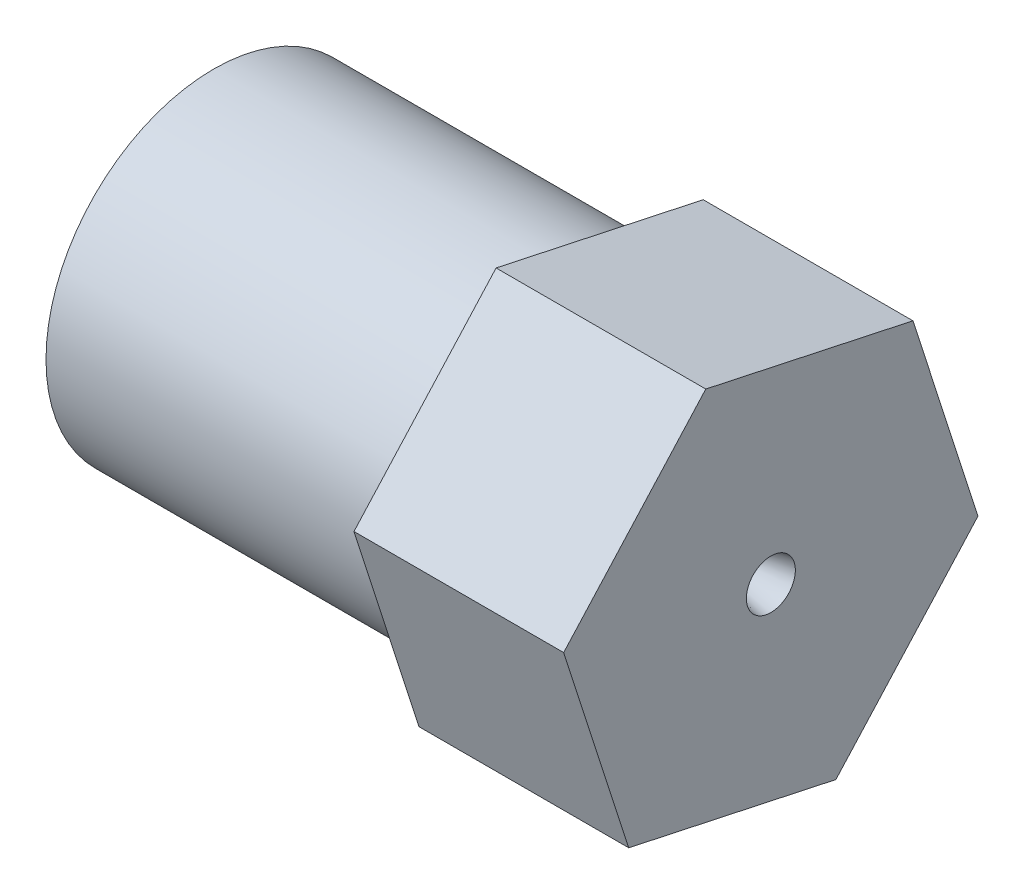
ISO-10303-21;
HEADER;
FILE_DESCRIPTION(('STEP AP214'),'2;1');
FILE_NAME('part.step','',(''),(''),'','','');
FILE_SCHEMA(('AUTOMOTIVE_DESIGN { 1 0 10303 214 1 1 1 1 }'));
ENDSEC;
DATA;
#1=APPLICATION_CONTEXT('core data for automotive mechanical design processes');
#2=APPLICATION_PROTOCOL_DEFINITION('international standard','automotive_design',2000,#1);
#3=PRODUCT_CONTEXT('',#1,'mechanical');
#4=PRODUCT('Part','Part','',(#3));
#5=PRODUCT_RELATED_PRODUCT_CATEGORY('part','',(#4));
#6=PRODUCT_DEFINITION_FORMATION('','',#4);
#7=PRODUCT_DEFINITION_CONTEXT('part definition',#1,'design');
#8=PRODUCT_DEFINITION('design','',#6,#7);
#9=PRODUCT_DEFINITION_SHAPE('','',#8);
#10=(LENGTH_UNIT() NAMED_UNIT(*) SI_UNIT(.MILLI.,.METRE.));
#11=(NAMED_UNIT(*) PLANE_ANGLE_UNIT() SI_UNIT($,.RADIAN.));
#12=(NAMED_UNIT(*) SI_UNIT($,.STERADIAN.) SOLID_ANGLE_UNIT());
#13=UNCERTAINTY_MEASURE_WITH_UNIT(LENGTH_MEASURE(1.E-05),#10,'distance_accuracy_value','');
#14=(GEOMETRIC_REPRESENTATION_CONTEXT(3) GLOBAL_UNCERTAINTY_ASSIGNED_CONTEXT((#13)) GLOBAL_UNIT_ASSIGNED_CONTEXT((#10,
#11,#12)) REPRESENTATION_CONTEXT('',''));
#15=CARTESIAN_POINT('',(0.,0.,0.));
#16=DIRECTION('',(0.,0.,1.));
#17=DIRECTION('',(1.,0.,0.));
#18=AXIS2_PLACEMENT_3D('',#15,#16,#17);
#19=CARTESIAN_POINT('',(0.,0.,0.));
#20=DIRECTION('',(-1.,0.,0.));
#21=DIRECTION('',(0.,0.,1.));
#22=AXIS2_PLACEMENT_3D('',#19,#20,#21);
#23=CYLINDRICAL_SURFACE('',#22,10.16);
#24=CARTESIAN_POINT('',(-11.3476244205248,0.,0.));
#25=DIRECTION('',(1.,0.,0.));
#26=DIRECTION('',(0.,0.,-1.));
#27=AXIS2_PLACEMENT_3D('',#24,#25,#26);
#28=CIRCLE('',#27,10.16);
#29=CARTESIAN_POINT('',(-11.3476244205248,0.,-10.16));
#30=VERTEX_POINT('',#29);
#31=EDGE_CURVE('E11',#30,#30,#28,.F.);
#32=ORIENTED_EDGE('',*,*,#31,.T.);
#33=EDGE_LOOP('',(#32));
#34=FACE_BOUND('',#33,.T.);
#35=CARTESIAN_POINT('',(-31.75,0.,0.));
#36=DIRECTION('',(-1.,0.,0.));
#37=DIRECTION('',(0.,0.,1.));
#38=AXIS2_PLACEMENT_3D('',#35,#36,#37);
#39=CIRCLE('',#38,10.16);
#40=CARTESIAN_POINT('',(-31.75,0.,10.16));
#41=VERTEX_POINT('',#40);
#42=EDGE_CURVE('E225',#41,#41,#39,.T.);
#43=ORIENTED_EDGE('',*,*,#42,.F.);
#44=EDGE_LOOP('',(#43));
#45=FACE_BOUND('',#44,.T.);
#46=ADVANCED_FACE('F37',(#34,#45),#23,.T.);
#47=CARTESIAN_POINT('',(0.,0.,0.));
#48=DIRECTION('',(-1.,0.,0.));
#49=DIRECTION('',(0.,0.,1.));
#50=AXIS2_PLACEMENT_3D('',#47,#48,#49);
#51=TOROIDAL_SURFACE('',#50,2.5,1.5);
#52=CARTESIAN_POINT('',(0.,0.,0.));
#53=DIRECTION('',(-1.,0.,0.));
#54=DIRECTION('',(0.,0.,1.));
#55=AXIS2_PLACEMENT_3D('',#52,#53,#54);
#56=CIRCLE('',#55,1.00000000000469);
#57=CARTESIAN_POINT('',(0.,0.,1.00000000000469));
#58=VERTEX_POINT('',#57);
#59=EDGE_CURVE('E177',#58,#58,#56,.T.);
#60=ORIENTED_EDGE('',*,*,#59,.F.);
#61=EDGE_LOOP('',(#60));
#62=FACE_BOUND('',#61,.T.);
#63=CARTESIAN_POINT('',(-1.06066017177981,0.,0.));
#64=DIRECTION('',(-1.,0.,0.));
#65=DIRECTION('',(0.,0.,1.));
#66=AXIS2_PLACEMENT_3D('',#63,#64,#65);
#67=CIRCLE('',#66,1.43933982822017);
#68=CARTESIAN_POINT('',(-1.06066017177981,0.,1.43933982822017));
#69=VERTEX_POINT('',#68);
#70=EDGE_CURVE('E142',#69,#69,#67,.T.);
#71=ORIENTED_EDGE('',*,*,#70,.T.);
#72=EDGE_LOOP('',(#71));
#73=FACE_BOUND('',#72,.T.);
#74=ADVANCED_FACE('F166',(#62,#73),#51,.T.);
#75=CARTESIAN_POINT('',(0.,0.,0.));
#76=DIRECTION('',(-1.,0.,0.));
#77=DIRECTION('',(0.,0.,1.));
#78=AXIS2_PLACEMENT_3D('',#75,#76,#77);
#79=TOROIDAL_SURFACE('',#78,1.4,0.399999999995305);
#80=CARTESIAN_POINT('',(0.136808057467297,0.,0.));
#81=DIRECTION('',(-1.,0.,0.));
#82=DIRECTION('',(0.,0.,1.));
#83=AXIS2_PLACEMENT_3D('',#80,#81,#82);
#84=CIRCLE('',#83,1.02412295166682);
#85=CARTESIAN_POINT('',(0.136808057467297,0.,1.02412295166682));
#86=VERTEX_POINT('',#85);
#87=EDGE_CURVE('E231',#86,#86,#84,.T.);
#88=ORIENTED_EDGE('',*,*,#87,.F.);
#89=EDGE_LOOP('',(#88));
#90=FACE_BOUND('',#89,.T.);
#91=ORIENTED_EDGE('',*,*,#59,.T.);
#92=EDGE_LOOP('',(#91));
#93=FACE_BOUND('',#92,.T.);
#94=ADVANCED_FACE('F162',(#90,#93),#79,.T.);
#95=CARTESIAN_POINT('',(338051.273850491,-941136.196809642,0.));
#96=CARTESIAN_POINT('',(-342020.006511755,939693.644910991,0.));
#97=CARTESIAN_POINT('',(345989.286405248,-938246.996520535,0.));
#98=B_SPLINE_CURVE_WITH_KNOTS('',2,(#95,#96,#97),.UNSPECIFIED.,.F.,.F.,(3,3),(0.,1.),.UNSPECIFIED.);
#99=CARTESIAN_POINT('',(0.,0.,0.));
#100=DIRECTION('',(-1.,0.,0.));
#101=AXIS1_PLACEMENT('',#99,#100);
#102=SURFACE_OF_REVOLUTION('',#98,#101);
#103=CARTESIAN_POINT('',(1.98737557947519,0.,0.));
#104=DIRECTION('',(-1.,0.,0.));
#105=DIRECTION('',(0.,0.,1.));
#106=AXIS2_PLACEMENT_3D('',#103,#104,#105);
#107=CIRCLE('',#106,1.48323969741913);
#108=CARTESIAN_POINT('',(1.98737557947519,0.,1.48323969741913));
#109=VERTEX_POINT('',#108);
#110=EDGE_CURVE('E228',#109,#109,#107,.T.);
#111=ORIENTED_EDGE('',*,*,#110,.F.);
#112=EDGE_LOOP('',(#111));
#113=FACE_BOUND('',#112,.T.);
#114=ORIENTED_EDGE('',*,*,#87,.T.);
#115=EDGE_LOOP('',(#114));
#116=FACE_BOUND('',#115,.T.);
#117=ADVANCED_FACE('F157',(#113,#116),#102,.T.);
#118=CARTESIAN_POINT('',(1.98737557947519,10.16,0.));
#119=DIRECTION('',(-1.,0.,0.));
#120=DIRECTION('',(0.,0.,1.));
#121=AXIS2_PLACEMENT_3D('',#118,#119,#120);
#122=PLANE('',#121);
#123=ORIENTED_EDGE('',*,*,#110,.T.);
#124=EDGE_LOOP('',(#123));
#125=FACE_BOUND('',#124,.T.);
#126=DIRECTION('',(0.,-0.951681663898051,-0.307086324345838));
#127=VECTOR('',#126,1.);
#128=CARTESIAN_POINT('',(1.98737557947519,-3.41249677929312,10.5755624900671));
#129=LINE('',#128,#127);
#130=CARTESIAN_POINT('',(1.98737557947519,2.69330707117882,12.5457684242007));
#131=VERTEX_POINT('',#130);
#132=CARTESIAN_POINT('',(1.98737557947519,-9.51830062976507,8.60535655593348));
#133=VERTEX_POINT('',#132);
#134=EDGE_CURVE('E125',#131,#133,#129,.T.);
#135=ORIENTED_EDGE('',*,*,#134,.T.);
#136=DIRECTION('',(0.,-0.209896273910742,-0.977723659424475));
#137=VECTOR('',#136,1.);
#138=CARTESIAN_POINT('',(1.98737557947519,-10.8649541653545,2.33247234383312));
#139=LINE('',#138,#137);
#140=CARTESIAN_POINT('',(1.98737557947519,-12.2116077009439,-3.94041186826723));
#141=VERTEX_POINT('',#140);
#142=EDGE_CURVE('E128',#133,#141,#139,.T.);
#143=ORIENTED_EDGE('',*,*,#142,.T.);
#144=DIRECTION('',(0.,0.741785389987309,-0.670637335078637));
#145=VECTOR('',#144,1.);
#146=CARTESIAN_POINT('',(1.98737557947519,-7.45245738606136,-8.24309014623397));
#147=LINE('',#146,#145);
#148=CARTESIAN_POINT('',(1.98737557947519,-2.69330707117882,-12.5457684242007));
#149=VERTEX_POINT('',#148);
#150=EDGE_CURVE('E131',#141,#149,#147,.T.);
#151=ORIENTED_EDGE('',*,*,#150,.T.);
#152=DIRECTION('',(0.,0.951681663898051,0.307086324345838));
#153=VECTOR('',#152,1.);
#154=CARTESIAN_POINT('',(1.98737557947519,3.41249677929312,-10.5755624900671));
#155=LINE('',#154,#153);
#156=CARTESIAN_POINT('',(1.98737557947519,9.51830062976506,-8.60535655593348));
#157=VERTEX_POINT('',#156);
#158=EDGE_CURVE('E134',#149,#157,#155,.T.);
#159=ORIENTED_EDGE('',*,*,#158,.T.);
#160=DIRECTION('',(0.,0.209896273910742,0.977723659424475));
#161=VECTOR('',#160,1.);
#162=CARTESIAN_POINT('',(1.98737557947519,10.8649541653545,-2.33247234383312));
#163=LINE('',#162,#161);
#164=CARTESIAN_POINT('',(1.98737557947519,12.2116077009439,3.94041186826724));
#165=VERTEX_POINT('',#164);
#166=EDGE_CURVE('E102',#157,#165,#163,.T.);
#167=ORIENTED_EDGE('',*,*,#166,.T.);
#168=DIRECTION('',(0.,-0.741785389987309,0.670637335078637));
#169=VECTOR('',#168,1.);
#170=CARTESIAN_POINT('',(1.98737557947519,7.45245738606136,8.24309014623397));
#171=LINE('',#170,#169);
#172=EDGE_CURVE('E137',#165,#131,#171,.T.);
#173=ORIENTED_EDGE('',*,*,#172,.T.);
#174=EDGE_LOOP('',(#135,#143,#151,#159,#167,#173));
#175=FACE_BOUND('',#174,.T.);
#176=ADVANCED_FACE('F161',(#125,#175),#122,.F.);
#177=CARTESIAN_POINT('',(-31.75,10.16,0.));
#178=DIRECTION('',(1.,0.,0.));
#179=DIRECTION('',(0.,0.,-1.));
#180=AXIS2_PLACEMENT_3D('',#177,#178,#179);
#181=PLANE('',#180);
#182=CARTESIAN_POINT('',(-31.75,0.,0.));
#183=DIRECTION('',(-1.,0.,0.));
#184=DIRECTION('',(0.,0.,1.));
#185=AXIS2_PLACEMENT_3D('',#182,#183,#184);
#186=CIRCLE('',#185,8.6614);
#187=CARTESIAN_POINT('',(-31.75,0.,8.6614));
#188=VERTEX_POINT('',#187);
#189=EDGE_CURVE('E222',#188,#188,#186,.T.);
#190=ORIENTED_EDGE('',*,*,#189,.F.);
#191=EDGE_LOOP('',(#190));
#192=FACE_BOUND('',#191,.T.);
#193=ORIENTED_EDGE('',*,*,#42,.T.);
#194=EDGE_LOOP('',(#193));
#195=FACE_BOUND('',#194,.T.);
#196=ADVANCED_FACE('F249',(#192,#195),#181,.F.);
#197=CARTESIAN_POINT('',(-31.115,0.,0.));
#198=DIRECTION('',(-1.,0.,0.));
#199=DIRECTION('',(0.,0.,1.));
#200=AXIS2_PLACEMENT_3D('',#197,#198,#199);
#201=TOROIDAL_SURFACE('',#200,8.6614,0.635);
#202=CARTESIAN_POINT('',(-31.115,0.,0.));
#203=DIRECTION('',(-1.,0.,0.));
#204=DIRECTION('',(0.,0.,1.));
#205=AXIS2_PLACEMENT_3D('',#202,#203,#204);
#206=CIRCLE('',#205,8.02639999999999);
#207=CARTESIAN_POINT('',(-31.115,0.,8.02639999999999));
#208=VERTEX_POINT('',#207);
#209=EDGE_CURVE('E219',#208,#208,#206,.T.);
#210=ORIENTED_EDGE('',*,*,#209,.F.);
#211=EDGE_LOOP('',(#210));
#212=FACE_BOUND('',#211,.T.);
#213=ORIENTED_EDGE('',*,*,#189,.T.);
#214=EDGE_LOOP('',(#213));
#215=FACE_BOUND('',#214,.T.);
#216=ADVANCED_FACE('F251',(#212,#215),#201,.T.);
#217=CARTESIAN_POINT('',(0.,0.,0.));
#218=DIRECTION('',(-1.,0.,0.));
#219=DIRECTION('',(0.,0.,1.));
#220=AXIS2_PLACEMENT_3D('',#217,#218,#219);
#221=CYLINDRICAL_SURFACE('',#220,8.02639999999999);
#222=CARTESIAN_POINT('',(-25.019,0.,0.));
#223=DIRECTION('',(-1.,0.,0.));
#224=DIRECTION('',(0.,0.,1.));
#225=AXIS2_PLACEMENT_3D('',#222,#223,#224);
#226=CIRCLE('',#225,8.02639999999999);
#227=CARTESIAN_POINT('',(-25.019,0.,8.02639999999999));
#228=VERTEX_POINT('',#227);
#229=EDGE_CURVE('E216',#228,#228,#226,.T.);
#230=ORIENTED_EDGE('',*,*,#229,.F.);
#231=EDGE_LOOP('',(#230));
#232=FACE_BOUND('',#231,.T.);
#233=ORIENTED_EDGE('',*,*,#209,.T.);
#234=EDGE_LOOP('',(#233));
#235=FACE_BOUND('',#234,.T.);
#236=ADVANCED_FACE('F258',(#232,#235),#221,.F.);
#237=CARTESIAN_POINT('',(-25.019,0.,0.));
#238=DIRECTION('',(-1.,0.,0.));
#239=DIRECTION('',(0.,0.,1.));
#240=AXIS2_PLACEMENT_3D('',#237,#238,#239);
#241=TOROIDAL_SURFACE('',#240,7.89939999999999,0.127);
#242=CARTESIAN_POINT('',(-24.892,0.,0.));
#243=DIRECTION('',(-1.,0.,0.));
#244=DIRECTION('',(0.,0.,1.));
#245=AXIS2_PLACEMENT_3D('',#242,#243,#244);
#246=CIRCLE('',#245,7.89939999999999);
#247=CARTESIAN_POINT('',(-24.892,0.,7.89939999999999));
#248=VERTEX_POINT('',#247);
#249=EDGE_CURVE('E213',#248,#248,#246,.T.);
#250=ORIENTED_EDGE('',*,*,#249,.F.);
#251=EDGE_LOOP('',(#250));
#252=FACE_BOUND('',#251,.T.);
#253=ORIENTED_EDGE('',*,*,#229,.T.);
#254=EDGE_LOOP('',(#253));
#255=FACE_BOUND('',#254,.T.);
#256=ADVANCED_FACE('F266',(#252,#255),#241,.F.);
#257=CARTESIAN_POINT('',(-24.892,6.9469,0.));
#258=DIRECTION('',(1.,0.,0.));
#259=DIRECTION('',(0.,0.,-1.));
#260=AXIS2_PLACEMENT_3D('',#257,#258,#259);
#261=PLANE('',#260);
#262=CARTESIAN_POINT('',(-24.892,0.,0.));
#263=DIRECTION('',(-1.,0.,0.));
#264=DIRECTION('',(0.,0.,1.));
#265=AXIS2_PLACEMENT_3D('',#262,#263,#264);
#266=CIRCLE('',#265,6.9469);
#267=CARTESIAN_POINT('',(-24.892,0.,6.9469));
#268=VERTEX_POINT('',#267);
#269=EDGE_CURVE('E210',#268,#268,#266,.T.);
#270=ORIENTED_EDGE('',*,*,#269,.F.);
#271=EDGE_LOOP('',(#270));
#272=FACE_BOUND('',#271,.T.);
#273=ORIENTED_EDGE('',*,*,#249,.T.);
#274=EDGE_LOOP('',(#273));
#275=FACE_BOUND('',#274,.T.);
#276=ADVANCED_FACE('F270',(#272,#275),#261,.F.);
#277=CARTESIAN_POINT('',(0.,0.,0.));
#278=DIRECTION('',(-1.,0.,0.));
#279=DIRECTION('',(0.,0.,1.));
#280=AXIS2_PLACEMENT_3D('',#277,#278,#279);
#281=CYLINDRICAL_SURFACE('',#280,6.9469);
#282=CARTESIAN_POINT('',(-20.066,0.,0.));
#283=DIRECTION('',(-1.,0.,0.));
#284=DIRECTION('',(0.,0.,1.));
#285=AXIS2_PLACEMENT_3D('',#282,#283,#284);
#286=CIRCLE('',#285,6.9469);
#287=CARTESIAN_POINT('',(-20.066,0.,6.9469));
#288=VERTEX_POINT('',#287);
#289=EDGE_CURVE('E207',#288,#288,#286,.T.);
#290=ORIENTED_EDGE('',*,*,#289,.F.);
#291=EDGE_LOOP('',(#290));
#292=FACE_BOUND('',#291,.T.);
#293=ORIENTED_EDGE('',*,*,#269,.T.);
#294=EDGE_LOOP('',(#293));
#295=FACE_BOUND('',#294,.T.);
#296=ADVANCED_FACE('F274',(#292,#295),#281,.F.);
#297=CARTESIAN_POINT('',(-20.066,0.,0.));
#298=DIRECTION('',(-1.,0.,0.));
#299=DIRECTION('',(0.,0.,1.));
#300=AXIS2_PLACEMENT_3D('',#297,#298,#299);
#301=TOROIDAL_SURFACE('',#300,6.8199,0.127);
#302=CARTESIAN_POINT('',(-19.939,0.,0.));
#303=DIRECTION('',(-1.,0.,0.));
#304=DIRECTION('',(0.,0.,1.));
#305=AXIS2_PLACEMENT_3D('',#302,#303,#304);
#306=CIRCLE('',#305,6.8199);
#307=CARTESIAN_POINT('',(-19.939,0.,6.8199));
#308=VERTEX_POINT('',#307);
#309=EDGE_CURVE('E204',#308,#308,#306,.T.);
#310=ORIENTED_EDGE('',*,*,#309,.F.);
#311=EDGE_LOOP('',(#310));
#312=FACE_BOUND('',#311,.T.);
#313=ORIENTED_EDGE('',*,*,#289,.T.);
#314=EDGE_LOOP('',(#313));
#315=FACE_BOUND('',#314,.T.);
#316=ADVANCED_FACE('F278',(#312,#315),#301,.F.);
#317=CARTESIAN_POINT('',(-19.939,5.46100000000001,0.));
#318=DIRECTION('',(1.,0.,0.));
#319=DIRECTION('',(0.,0.,-1.));
#320=AXIS2_PLACEMENT_3D('',#317,#318,#319);
#321=PLANE('',#320);
#322=CARTESIAN_POINT('',(-19.939,0.,0.));
#323=DIRECTION('',(-1.,0.,0.));
#324=DIRECTION('',(0.,0.,1.));
#325=AXIS2_PLACEMENT_3D('',#322,#323,#324);
#326=CIRCLE('',#325,5.46100000000001);
#327=CARTESIAN_POINT('',(-19.939,0.,5.46100000000001));
#328=VERTEX_POINT('',#327);
#329=EDGE_CURVE('E201',#328,#328,#326,.T.);
#330=ORIENTED_EDGE('',*,*,#329,.F.);
#331=EDGE_LOOP('',(#330));
#332=FACE_BOUND('',#331,.T.);
#333=ORIENTED_EDGE('',*,*,#309,.T.);
#334=EDGE_LOOP('',(#333));
#335=FACE_BOUND('',#334,.T.);
#336=ADVANCED_FACE('F282',(#332,#335),#321,.F.);
#337=CARTESIAN_POINT('',(-19.304,0.,0.));
#338=DIRECTION('',(-1.,0.,0.));
#339=DIRECTION('',(0.,0.,1.));
#340=AXIS2_PLACEMENT_3D('',#337,#338,#339);
#341=TOROIDAL_SURFACE('',#340,5.461,0.635);
#342=CARTESIAN_POINT('',(-19.304,0.,0.));
#343=DIRECTION('',(-1.,0.,0.));
#344=DIRECTION('',(0.,0.,1.));
#345=AXIS2_PLACEMENT_3D('',#342,#343,#344);
#346=CIRCLE('',#345,4.826);
#347=CARTESIAN_POINT('',(-19.304,0.,4.826));
#348=VERTEX_POINT('',#347);
#349=EDGE_CURVE('E198',#348,#348,#346,.T.);
#350=ORIENTED_EDGE('',*,*,#349,.F.);
#351=EDGE_LOOP('',(#350));
#352=FACE_BOUND('',#351,.T.);
#353=ORIENTED_EDGE('',*,*,#329,.T.);
#354=EDGE_LOOP('',(#353));
#355=FACE_BOUND('',#354,.T.);
#356=ADVANCED_FACE('F286',(#352,#355),#341,.T.);
#357=CARTESIAN_POINT('',(0.,0.,0.));
#358=DIRECTION('',(-1.,0.,0.));
#359=DIRECTION('',(0.,0.,1.));
#360=AXIS2_PLACEMENT_3D('',#357,#358,#359);
#361=CYLINDRICAL_SURFACE('',#360,4.826);
#362=CARTESIAN_POINT('',(-13.589,0.,0.));
#363=DIRECTION('',(-1.,0.,0.));
#364=DIRECTION('',(0.,0.,1.));
#365=AXIS2_PLACEMENT_3D('',#362,#363,#364);
#366=CIRCLE('',#365,4.826);
#367=CARTESIAN_POINT('',(-13.589,0.,4.826));
#368=VERTEX_POINT('',#367);
#369=EDGE_CURVE('E195',#368,#368,#366,.T.);
#370=ORIENTED_EDGE('',*,*,#369,.F.);
#371=EDGE_LOOP('',(#370));
#372=FACE_BOUND('',#371,.T.);
#373=ORIENTED_EDGE('',*,*,#349,.T.);
#374=EDGE_LOOP('',(#373));
#375=FACE_BOUND('',#374,.T.);
#376=ADVANCED_FACE('F290',(#372,#375),#361,.F.);
#377=CARTESIAN_POINT('',(-13.589,0.,0.));
#378=DIRECTION('',(-1.,0.,0.));
#379=DIRECTION('',(0.,0.,1.));
#380=AXIS2_PLACEMENT_3D('',#377,#378,#379);
#381=TOROIDAL_SURFACE('',#380,4.699,0.127);
#382=CARTESIAN_POINT('',(-13.462,0.,0.));
#383=DIRECTION('',(-1.,0.,0.));
#384=DIRECTION('',(0.,0.,1.));
#385=AXIS2_PLACEMENT_3D('',#382,#383,#384);
#386=CIRCLE('',#385,4.699);
#387=CARTESIAN_POINT('',(-13.462,0.,4.699));
#388=VERTEX_POINT('',#387);
#389=EDGE_CURVE('E192',#388,#388,#386,.T.);
#390=ORIENTED_EDGE('',*,*,#389,.F.);
#391=EDGE_LOOP('',(#390));
#392=FACE_BOUND('',#391,.T.);
#393=ORIENTED_EDGE('',*,*,#369,.T.);
#394=EDGE_LOOP('',(#393));
#395=FACE_BOUND('',#394,.T.);
#396=ADVANCED_FACE('F294',(#392,#395),#381,.F.);
#397=CARTESIAN_POINT('',(-13.462,4.445,0.));
#398=DIRECTION('',(1.,0.,0.));
#399=DIRECTION('',(0.,0.,-1.));
#400=AXIS2_PLACEMENT_3D('',#397,#398,#399);
#401=PLANE('',#400);
#402=CARTESIAN_POINT('',(-13.462,0.,0.));
#403=DIRECTION('',(-1.,0.,0.));
#404=DIRECTION('',(0.,0.,1.));
#405=AXIS2_PLACEMENT_3D('',#402,#403,#404);
#406=CIRCLE('',#405,4.445);
#407=CARTESIAN_POINT('',(-13.462,0.,4.445));
#408=VERTEX_POINT('',#407);
#409=EDGE_CURVE('E187',#408,#408,#406,.T.);
#410=ORIENTED_EDGE('',*,*,#409,.F.);
#411=EDGE_LOOP('',(#410));
#412=FACE_BOUND('',#411,.T.);
#413=ORIENTED_EDGE('',*,*,#389,.T.);
#414=EDGE_LOOP('',(#413));
#415=FACE_BOUND('',#414,.T.);
#416=ADVANCED_FACE('F298',(#412,#415),#401,.F.);
#417=CARTESIAN_POINT('',(0.,0.,0.));
#418=DIRECTION('',(-1.,0.,0.));
#419=DIRECTION('',(0.,0.,1.));
#420=AXIS2_PLACEMENT_3D('',#417,#418,#419);
#421=CYLINDRICAL_SURFACE('',#420,4.445);
#422=CARTESIAN_POINT('',(-5.38144840409426,0.,0.));
#423=DIRECTION('',(-1.,0.,0.));
#424=DIRECTION('',(0.,0.,1.));
#425=AXIS2_PLACEMENT_3D('',#422,#423,#424);
#426=CIRCLE('',#425,4.445);
#427=CARTESIAN_POINT('',(-5.38144840409426,0.,4.445));
#428=VERTEX_POINT('',#427);
#429=EDGE_CURVE('E183',#428,#428,#426,.T.);
#430=ORIENTED_EDGE('',*,*,#429,.F.);
#431=EDGE_LOOP('',(#430));
#432=FACE_BOUND('',#431,.T.);
#433=ORIENTED_EDGE('',*,*,#409,.T.);
#434=EDGE_LOOP('',(#433));
#435=FACE_BOUND('',#434,.T.);
#436=ADVANCED_FACE('F302',(#432,#435),#421,.F.);
#437=CARTESIAN_POINT('',(-5.38144840409426,0.,0.));
#438=DIRECTION('',(-1.,0.,0.));
#439=DIRECTION('',(0.,0.,1.));
#440=AXIS2_PLACEMENT_3D('',#437,#438,#439);
#441=DEGENERATE_TOROIDAL_SURFACE('',#440,1.27,3.175,.T.);
#442=CARTESIAN_POINT('',(-3.136384373827,0.,0.));
#443=DIRECTION('',(-1.,0.,0.));
#444=DIRECTION('',(0.,0.,1.));
#445=AXIS2_PLACEMENT_3D('',#442,#443,#444);
#446=CIRCLE('',#445,3.51506403026731);
#447=CARTESIAN_POINT('',(-3.136384373827,0.,3.51506403026731));
#448=VERTEX_POINT('',#447);
#449=EDGE_CURVE('E181',#448,#448,#446,.T.);
#450=ORIENTED_EDGE('',*,*,#449,.F.);
#451=EDGE_LOOP('',(#450));
#452=FACE_BOUND('',#451,.T.);
#453=ORIENTED_EDGE('',*,*,#429,.T.);
#454=EDGE_LOOP('',(#453));
#455=FACE_BOUND('',#454,.T.);
#456=ADVANCED_FACE('F306',(#452,#455),#441,.F.);
#457=CARTESIAN_POINT('',(-3.136384373827,0.,0.));
#458=DIRECTION('',(-1.,0.,0.));
#459=DIRECTION('',(0.,0.,1.));
#460=AXIS2_PLACEMENT_3D('',#457,#458,#459);
#461=CONICAL_SURFACE('',#460,3.51506403026731,0.785398163397437);
#462=ORIENTED_EDGE('',*,*,#70,.F.);
#463=EDGE_LOOP('',(#462));
#464=FACE_BOUND('',#463,.T.);
#465=ORIENTED_EDGE('',*,*,#449,.T.);
#466=EDGE_LOOP('',(#465));
#467=FACE_BOUND('',#466,.T.);
#468=ADVANCED_FACE('F310',(#464,#467),#461,.F.);
#469=CARTESIAN_POINT('',(-10.7126244205248,-3.41249677929312,10.5755624900671));
#470=DIRECTION('',(0.,-0.307086324345838,0.951681663898051));
#471=DIRECTION('',(0.,-0.951681663898051,-0.307086324345838));
#472=AXIS2_PLACEMENT_3D('',#469,#470,#471);
#473=PLANE('',#472);
#474=ORIENTED_EDGE('',*,*,#134,.F.);
#475=DIRECTION('',(1.,0.,0.));
#476=VECTOR('',#475,1.);
#477=CARTESIAN_POINT('',(-10.7126244205248,2.69330707117882,12.5457684242007));
#478=LINE('',#477,#476);
#479=CARTESIAN_POINT('',(-10.7126244205248,2.69330707117882,12.5457684242007));
#480=VERTEX_POINT('',#479);
#481=EDGE_CURVE('E54',#480,#131,#478,.T.);
#482=ORIENTED_EDGE('',*,*,#481,.F.);
#483=DIRECTION('',(0.,-0.951681663898051,-0.307086324345838));
#484=VECTOR('',#483,1.);
#485=CARTESIAN_POINT('',(-10.7126244205248,-3.41249677929312,10.5755624900671));
#486=LINE('',#485,#484);
#487=CARTESIAN_POINT('',(-10.7126244205248,-9.51830062976507,8.60535655593348));
#488=VERTEX_POINT('',#487);
#489=EDGE_CURVE('E140',#480,#488,#486,.T.);
#490=ORIENTED_EDGE('',*,*,#489,.T.);
#491=DIRECTION('',(1.,0.,0.));
#492=VECTOR('',#491,1.);
#493=CARTESIAN_POINT('',(-10.7126244205248,-9.51830062976507,8.60535655593348));
#494=LINE('',#493,#492);
#495=EDGE_CURVE('E89',#488,#133,#494,.T.);
#496=ORIENTED_EDGE('',*,*,#495,.T.);
#497=EDGE_LOOP('',(#474,#482,#490,#496));
#498=FACE_BOUND('',#497,.T.);
#499=ADVANCED_FACE('F314',(#498),#473,.T.);
#500=CARTESIAN_POINT('',(-10.7126244205248,7.45245738606136,8.24309014623397));
#501=DIRECTION('',(0.,0.670637335078637,0.741785389987309));
#502=DIRECTION('',(0.,-0.741785389987309,0.670637335078637));
#503=AXIS2_PLACEMENT_3D('',#500,#501,#502);
#504=PLANE('',#503);
#505=ORIENTED_EDGE('',*,*,#172,.F.);
#506=DIRECTION('',(1.,0.,0.));
#507=VECTOR('',#506,1.);
#508=CARTESIAN_POINT('',(-10.7126244205248,12.2116077009439,3.94041186826724));
#509=LINE('',#508,#507);
#510=CARTESIAN_POINT('',(-10.7126244205248,12.2116077009439,3.94041186826724));
#511=VERTEX_POINT('',#510);
#512=EDGE_CURVE('E77',#511,#165,#509,.T.);
#513=ORIENTED_EDGE('',*,*,#512,.F.);
#514=DIRECTION('',(0.,-0.741785389987309,0.670637335078637));
#515=VECTOR('',#514,1.);
#516=CARTESIAN_POINT('',(-10.7126244205248,7.45245738606136,8.24309014623397));
#517=LINE('',#516,#515);
#518=EDGE_CURVE('E115',#511,#480,#517,.T.);
#519=ORIENTED_EDGE('',*,*,#518,.T.);
#520=ORIENTED_EDGE('',*,*,#481,.T.);
#521=EDGE_LOOP('',(#505,#513,#519,#520));
#522=FACE_BOUND('',#521,.T.);
#523=ADVANCED_FACE('F317',(#522),#504,.T.);
#524=CARTESIAN_POINT('',(-10.7126244205248,10.8649541653545,-2.33247234383312));
#525=DIRECTION('',(0.,0.977723659424475,-0.209896273910742));
#526=DIRECTION('',(0.,0.209896273910742,0.977723659424475));
#527=AXIS2_PLACEMENT_3D('',#524,#525,#526);
#528=PLANE('',#527);
#529=ORIENTED_EDGE('',*,*,#166,.F.);
#530=DIRECTION('',(1.,0.,0.));
#531=VECTOR('',#530,1.);
#532=CARTESIAN_POINT('',(-10.7126244205248,9.51830062976506,-8.60535655593348));
#533=LINE('',#532,#531);
#534=CARTESIAN_POINT('',(-10.7126244205248,9.51830062976506,-8.60535655593348));
#535=VERTEX_POINT('',#534);
#536=EDGE_CURVE('E97',#535,#157,#533,.T.);
#537=ORIENTED_EDGE('',*,*,#536,.F.);
#538=DIRECTION('',(0.,0.209896273910742,0.977723659424475));
#539=VECTOR('',#538,1.);
#540=CARTESIAN_POINT('',(-10.7126244205248,10.8649541653545,-2.33247234383312));
#541=LINE('',#540,#539);
#542=EDGE_CURVE('E100',#535,#511,#541,.T.);
#543=ORIENTED_EDGE('',*,*,#542,.T.);
#544=ORIENTED_EDGE('',*,*,#512,.T.);
#545=EDGE_LOOP('',(#529,#537,#543,#544));
#546=FACE_BOUND('',#545,.T.);
#547=ADVANCED_FACE('F99',(#546),#528,.T.);
#548=CARTESIAN_POINT('',(-10.7126244205248,3.41249677929312,-10.5755624900671));
#549=DIRECTION('',(0.,0.307086324345838,-0.951681663898051));
#550=DIRECTION('',(0.,0.951681663898051,0.307086324345838));
#551=AXIS2_PLACEMENT_3D('',#548,#549,#550);
#552=PLANE('',#551);
#553=ORIENTED_EDGE('',*,*,#158,.F.);
#554=DIRECTION('',(1.,0.,0.));
#555=VECTOR('',#554,1.);
#556=CARTESIAN_POINT('',(-10.7126244205248,-2.69330707117882,-12.5457684242007));
#557=LINE('',#556,#555);
#558=CARTESIAN_POINT('',(-10.7126244205248,-2.69330707117882,-12.5457684242007));
#559=VERTEX_POINT('',#558);
#560=EDGE_CURVE('E107',#559,#149,#557,.T.);
#561=ORIENTED_EDGE('',*,*,#560,.F.);
#562=DIRECTION('',(0.,0.951681663898051,0.307086324345838));
#563=VECTOR('',#562,1.);
#564=CARTESIAN_POINT('',(-10.7126244205248,3.41249677929312,-10.5755624900671));
#565=LINE('',#564,#563);
#566=EDGE_CURVE('E113',#559,#535,#565,.T.);
#567=ORIENTED_EDGE('',*,*,#566,.T.);
#568=ORIENTED_EDGE('',*,*,#536,.T.);
#569=EDGE_LOOP('',(#553,#561,#567,#568));
#570=FACE_BOUND('',#569,.T.);
#571=ADVANCED_FACE('F117',(#570),#552,.T.);
#572=CARTESIAN_POINT('',(-10.7126244205248,-7.45245738606136,-8.24309014623397));
#573=DIRECTION('',(0.,-0.670637335078637,-0.741785389987309));
#574=DIRECTION('',(0.,0.741785389987309,-0.670637335078637));
#575=AXIS2_PLACEMENT_3D('',#572,#573,#574);
#576=PLANE('',#575);
#577=ORIENTED_EDGE('',*,*,#150,.F.);
#578=DIRECTION('',(1.,0.,0.));
#579=VECTOR('',#578,1.);
#580=CARTESIAN_POINT('',(-10.7126244205248,-12.2116077009439,-3.94041186826723));
#581=LINE('',#580,#579);
#582=CARTESIAN_POINT('',(-10.7126244205248,-12.2116077009439,-3.94041186826723));
#583=VERTEX_POINT('',#582);
#584=EDGE_CURVE('E145',#583,#141,#581,.T.);
#585=ORIENTED_EDGE('',*,*,#584,.F.);
#586=DIRECTION('',(0.,0.741785389987309,-0.670637335078637));
#587=VECTOR('',#586,1.);
#588=CARTESIAN_POINT('',(-10.7126244205248,-7.45245738606136,-8.24309014623397));
#589=LINE('',#588,#587);
#590=EDGE_CURVE('E118',#583,#559,#589,.T.);
#591=ORIENTED_EDGE('',*,*,#590,.T.);
#592=ORIENTED_EDGE('',*,*,#560,.T.);
#593=EDGE_LOOP('',(#577,#585,#591,#592));
#594=FACE_BOUND('',#593,.T.);
#595=ADVANCED_FACE('F320',(#594),#576,.T.);
#596=CARTESIAN_POINT('',(-10.7126244205248,-10.8649541653545,2.33247234383312));
#597=DIRECTION('',(0.,-0.977723659424475,0.209896273910742));
#598=DIRECTION('',(0.,-0.209896273910742,-0.977723659424475));
#599=AXIS2_PLACEMENT_3D('',#596,#597,#598);
#600=PLANE('',#599);
#601=ORIENTED_EDGE('',*,*,#142,.F.);
#602=ORIENTED_EDGE('',*,*,#495,.F.);
#603=DIRECTION('',(0.,-0.209896273910742,-0.977723659424475));
#604=VECTOR('',#603,1.);
#605=CARTESIAN_POINT('',(-10.7126244205248,-10.8649541653545,2.33247234383312));
#606=LINE('',#605,#604);
#607=EDGE_CURVE('E120',#488,#583,#606,.T.);
#608=ORIENTED_EDGE('',*,*,#607,.T.);
#609=ORIENTED_EDGE('',*,*,#584,.T.);
#610=EDGE_LOOP('',(#601,#602,#608,#609));
#611=FACE_BOUND('',#610,.T.);
#612=ADVANCED_FACE('F243',(#611),#600,.T.);
#613=CARTESIAN_POINT('',(-10.7126244205248,0.,0.));
#614=DIRECTION('',(1.,0.,0.));
#615=DIRECTION('',(0.,0.,-1.));
#616=AXIS2_PLACEMENT_3D('',#613,#614,#615);
#617=PLANE('',#616);
#618=CARTESIAN_POINT('',(-10.7126244205248,0.,0.));
#619=DIRECTION('',(1.,0.,0.));
#620=DIRECTION('',(0.,0.,-1.));
#621=AXIS2_PLACEMENT_3D('',#618,#619,#620);
#622=CIRCLE('',#621,10.795);
#623=CARTESIAN_POINT('',(-10.7126244205248,0.,-10.795));
#624=VERTEX_POINT('',#623);
#625=EDGE_CURVE('E46',#624,#624,#622,.T.);
#626=ORIENTED_EDGE('',*,*,#625,.T.);
#627=EDGE_LOOP('',(#626));
#628=FACE_BOUND('',#627,.T.);
#629=ORIENTED_EDGE('',*,*,#489,.F.);
#630=ORIENTED_EDGE('',*,*,#518,.F.);
#631=ORIENTED_EDGE('',*,*,#542,.F.);
#632=ORIENTED_EDGE('',*,*,#566,.F.);
#633=ORIENTED_EDGE('',*,*,#590,.F.);
#634=ORIENTED_EDGE('',*,*,#607,.F.);
#635=EDGE_LOOP('',(#629,#630,#631,#632,#633,#634));
#636=FACE_BOUND('',#635,.T.);
#637=ADVANCED_FACE('F111',(#628,#636),#617,.F.);
#638=CARTESIAN_POINT('',(-11.3476244205248,0.,0.));
#639=DIRECTION('',(1.,0.,0.));
#640=DIRECTION('',(0.,0.,-1.));
#641=AXIS2_PLACEMENT_3D('',#638,#639,#640);
#642=TOROIDAL_SURFACE('',#641,10.795,0.635);
#643=ORIENTED_EDGE('',*,*,#31,.F.);
#644=EDGE_LOOP('',(#643));
#645=FACE_BOUND('',#644,.T.);
#646=ORIENTED_EDGE('',*,*,#625,.F.);
#647=EDGE_LOOP('',(#646));
#648=FACE_BOUND('',#647,.T.);
#649=ADVANCED_FACE('F39',(#645,#648),#642,.F.);
#650=CLOSED_SHELL('',(#46,#74,#94,#117,#176,#196,#216,#236,#256,#276,#296,#316,#336,#356,#376,
#396,#416,#436,#456,#468,#499,#523,#547,#571,#595,#612,#637,#649));
#651=MANIFOLD_SOLID_BREP('B2',#650);
#652=ADVANCED_BREP_SHAPE_REPRESENTATION('',(#18,#651),#14);
#653=SHAPE_DEFINITION_REPRESENTATION(#9,#652);
ENDSEC;
END-ISO-10303-21;
